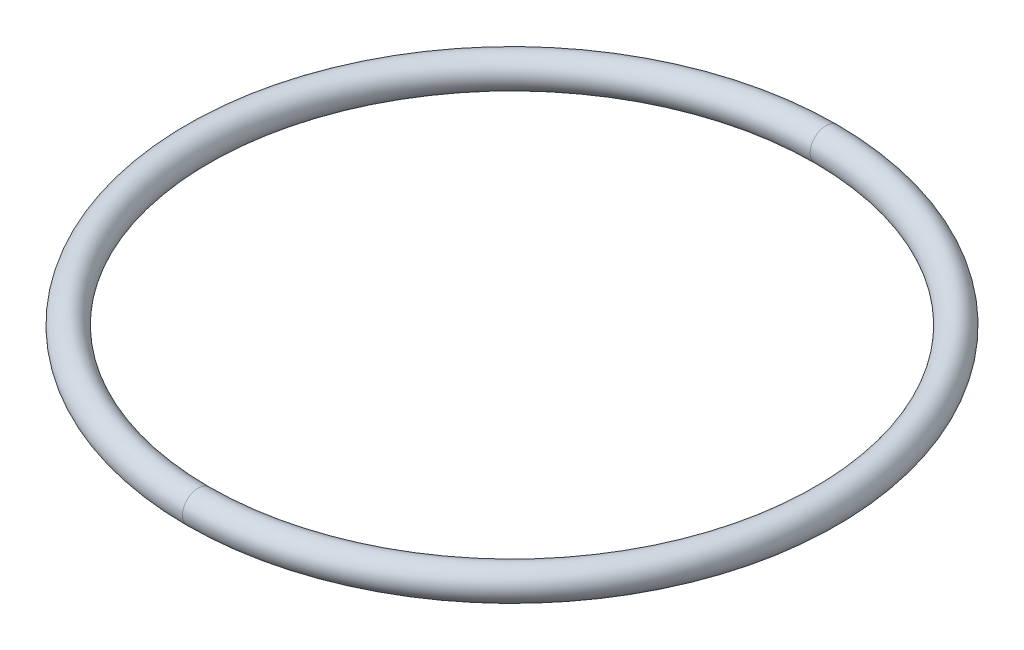
ISO-10303-21;
HEADER;
FILE_DESCRIPTION(('STEP AP214'),'2;1');
FILE_NAME('part.step','',(''),(''),'','','');
FILE_SCHEMA(('AUTOMOTIVE_DESIGN { 1 0 10303 214 1 1 1 1 }'));
ENDSEC;
DATA;
#1=APPLICATION_CONTEXT('core data for automotive mechanical design processes');
#2=APPLICATION_PROTOCOL_DEFINITION('international standard','automotive_design',2000,#1);
#3=PRODUCT_CONTEXT('',#1,'mechanical');
#4=PRODUCT('Part','Part','',(#3));
#5=PRODUCT_RELATED_PRODUCT_CATEGORY('part','',(#4));
#6=PRODUCT_DEFINITION_FORMATION('','',#4);
#7=PRODUCT_DEFINITION_CONTEXT('part definition',#1,'design');
#8=PRODUCT_DEFINITION('design','',#6,#7);
#9=PRODUCT_DEFINITION_SHAPE('','',#8);
#10=(LENGTH_UNIT() NAMED_UNIT(*) SI_UNIT(.MILLI.,.METRE.));
#11=(NAMED_UNIT(*) PLANE_ANGLE_UNIT() SI_UNIT($,.RADIAN.));
#12=(NAMED_UNIT(*) SI_UNIT($,.STERADIAN.) SOLID_ANGLE_UNIT());
#13=UNCERTAINTY_MEASURE_WITH_UNIT(LENGTH_MEASURE(1.E-05),#10,'distance_accuracy_value','');
#14=(GEOMETRIC_REPRESENTATION_CONTEXT(3) GLOBAL_UNCERTAINTY_ASSIGNED_CONTEXT((#13)) GLOBAL_UNIT_ASSIGNED_CONTEXT((#10,
#11,#12)) REPRESENTATION_CONTEXT('',''));
#15=CARTESIAN_POINT('',(0.,0.,0.));
#16=DIRECTION('',(0.,0.,1.));
#17=DIRECTION('',(1.,0.,0.));
#18=AXIS2_PLACEMENT_3D('',#15,#16,#17);
#19=CARTESIAN_POINT('',(0.,0.,0.));
#20=DIRECTION('',(0.,1.,0.));
#21=DIRECTION('',(0.,0.,1.));
#22=AXIS2_PLACEMENT_3D('',#19,#20,#21);
#23=TOROIDAL_SURFACE('',#22,1000.,50.);
#24=CARTESIAN_POINT('',(-2.44921270764475E-13,0.,-1000.));
#25=DIRECTION('',(1.,0.,0.));
#26=DIRECTION('',(0.,0.,-1.));
#27=AXIS2_PLACEMENT_3D('',#24,#25,#26);
#28=CIRCLE('',#27,50.);
#29=CARTESIAN_POINT('',(-2.57167334302699E-13,0.,-1050.));
#30=VERTEX_POINT('',#29);
#31=EDGE_CURVE('E12',#30,#30,#28,.T.);
#32=CARTESIAN_POINT('',(1.22460635382238E-13,0.,1000.));
#33=DIRECTION('',(1.,0.,0.));
#34=DIRECTION('',(0.,0.,-1.));
#35=AXIS2_PLACEMENT_3D('',#32,#33,#34);
#36=CIRCLE('',#35,50.);
#37=CARTESIAN_POINT('',(1.2858366715135E-13,0.,1050.));
#38=VERTEX_POINT('',#37);
#39=EDGE_CURVE('E55',#38,#38,#36,.T.);
#40=CARTESIAN_POINT('',(0.,0.,0.));
#41=DIRECTION('',(0.,1.,0.));
#42=DIRECTION('',(0.,0.,1.));
#43=AXIS2_PLACEMENT_3D('',#40,#41,#42);
#44=CIRCLE('',#43,1050.);
#45=EDGE_CURVE('',#30,#38,#44,.T.);
#46=ORIENTED_EDGE('',*,*,#31,.F.);
#47=ORIENTED_EDGE('',*,*,#39,.F.);
#48=ORIENTED_EDGE('',*,*,#45,.T.);
#49=ORIENTED_EDGE('',*,*,#45,.F.);
#50=EDGE_LOOP('',(#46,#48,#47,#49));
#51=FACE_BOUND('',#50,.T.);
#52=ADVANCED_FACE('F51',(#51),#23,.T.);
#53=CARTESIAN_POINT('',(-1.83690953073357E-13,0.,1000.));
#54=DIRECTION('',(1.,0.,0.));
#55=DIRECTION('',(0.,0.,-1.));
#56=AXIS2_PLACEMENT_3D('',#53,#54,#55);
#57=PLANE('',#56);
#58=ORIENTED_EDGE('',*,*,#39,.T.);
#59=EDGE_LOOP('',(#58));
#60=FACE_BOUND('',#59,.T.);
#61=ADVANCED_FACE('F64',(#60),#57,.T.);
#62=CARTESIAN_POINT('',(0.,0.,-1000.));
#63=DIRECTION('',(1.,0.,0.));
#64=DIRECTION('',(0.,0.,-1.));
#65=AXIS2_PLACEMENT_3D('',#62,#63,#64);
#66=PLANE('',#65);
#67=ORIENTED_EDGE('',*,*,#31,.T.);
#68=EDGE_LOOP('',(#67));
#69=FACE_BOUND('',#68,.T.);
#70=ADVANCED_FACE('F53',(#69),#66,.T.);
#71=CLOSED_SHELL('',(#52,#61,#70));
#72=MANIFOLD_SOLID_BREP('B2',#71);
#73=CARTESIAN_POINT('',(0.,0.,0.));
#74=DIRECTION('',(0.,1.,0.));
#75=DIRECTION('',(0.,0.,1.));
#76=AXIS2_PLACEMENT_3D('',#73,#74,#75);
#77=TOROIDAL_SURFACE('',#76,1000.,50.);
#78=CARTESIAN_POINT('',(1.22460635382238E-13,0.,1000.));
#79=DIRECTION('',(-1.,0.,0.));
#80=DIRECTION('',(0.,0.,1.));
#81=AXIS2_PLACEMENT_3D('',#78,#79,#80);
#82=CIRCLE('',#81,50.);
#83=CARTESIAN_POINT('',(1.2858366715135E-13,0.,1050.));
#84=VERTEX_POINT('',#83);
#85=EDGE_CURVE('E122',#84,#84,#82,.T.);
#86=CARTESIAN_POINT('',(0.,0.,-1000.));
#87=DIRECTION('',(-1.,0.,0.));
#88=DIRECTION('',(0.,0.,1.));
#89=AXIS2_PLACEMENT_3D('',#86,#87,#88);
#90=CIRCLE('',#89,50.);
#91=CARTESIAN_POINT('',(0.,0.,-1050.));
#92=VERTEX_POINT('',#91);
#93=EDGE_CURVE('E50',#92,#92,#90,.T.);
#94=CARTESIAN_POINT('',(0.,0.,0.));
#95=DIRECTION('',(0.,1.,0.));
#96=DIRECTION('',(0.,0.,1.));
#97=AXIS2_PLACEMENT_3D('',#94,#95,#96);
#98=CIRCLE('',#97,1050.);
#99=EDGE_CURVE('',#84,#92,#98,.T.);
#100=ORIENTED_EDGE('',*,*,#85,.F.);
#101=ORIENTED_EDGE('',*,*,#93,.F.);
#102=ORIENTED_EDGE('',*,*,#99,.T.);
#103=ORIENTED_EDGE('',*,*,#99,.F.);
#104=EDGE_LOOP('',(#100,#102,#101,#103));
#105=FACE_BOUND('',#104,.T.);
#106=ADVANCED_FACE('F118',(#105),#77,.T.);
#107=CARTESIAN_POINT('',(-1.83690953073357E-13,0.,1000.));
#108=DIRECTION('',(-1.,0.,0.));
#109=DIRECTION('',(0.,0.,1.));
#110=AXIS2_PLACEMENT_3D('',#107,#108,#109);
#111=PLANE('',#110);
#112=ORIENTED_EDGE('',*,*,#85,.T.);
#113=EDGE_LOOP('',(#112));
#114=FACE_BOUND('',#113,.T.);
#115=ADVANCED_FACE('F131',(#114),#111,.T.);
#116=CARTESIAN_POINT('',(0.,0.,-1000.));
#117=DIRECTION('',(-1.,0.,0.));
#118=DIRECTION('',(0.,0.,1.));
#119=AXIS2_PLACEMENT_3D('',#116,#117,#118);
#120=PLANE('',#119);
#121=ORIENTED_EDGE('',*,*,#93,.T.);
#122=EDGE_LOOP('',(#121));
#123=FACE_BOUND('',#122,.T.);
#124=ADVANCED_FACE('F120',(#123),#120,.T.);
#125=CLOSED_SHELL('',(#106,#115,#124));
#126=MANIFOLD_SOLID_BREP('B7',#125);
#127=ADVANCED_BREP_SHAPE_REPRESENTATION('',(#18,#72,#126),#14);
#128=SHAPE_DEFINITION_REPRESENTATION(#9,#127);
ENDSEC;
END-ISO-10303-21;
